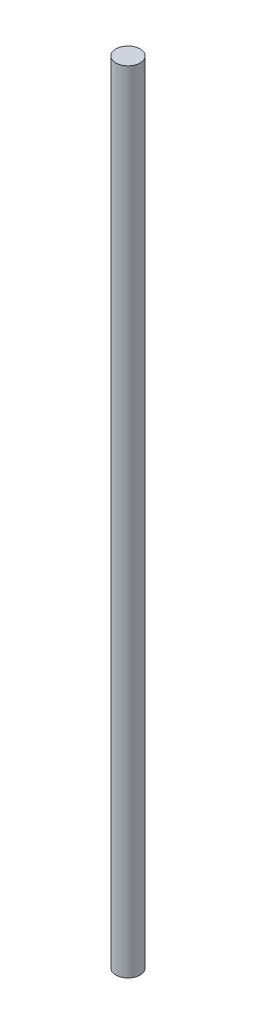
ISO-10303-21;
HEADER;
FILE_DESCRIPTION(('STEP AP214'),'2;1');
FILE_NAME('part.step','',(''),(''),'','','');
FILE_SCHEMA(('AUTOMOTIVE_DESIGN { 1 0 10303 214 1 1 1 1 }'));
ENDSEC;
DATA;
#1=APPLICATION_CONTEXT('core data for automotive mechanical design processes');
#2=APPLICATION_PROTOCOL_DEFINITION('international standard','automotive_design',2000,#1);
#3=PRODUCT_CONTEXT('',#1,'mechanical');
#4=PRODUCT('Part','Part','',(#3));
#5=PRODUCT_RELATED_PRODUCT_CATEGORY('part','',(#4));
#6=PRODUCT_DEFINITION_FORMATION('','',#4);
#7=PRODUCT_DEFINITION_CONTEXT('part definition',#1,'design');
#8=PRODUCT_DEFINITION('design','',#6,#7);
#9=PRODUCT_DEFINITION_SHAPE('','',#8);
#10=(LENGTH_UNIT() NAMED_UNIT(*) SI_UNIT(.MILLI.,.METRE.));
#11=(NAMED_UNIT(*) PLANE_ANGLE_UNIT() SI_UNIT($,.RADIAN.));
#12=(NAMED_UNIT(*) SI_UNIT($,.STERADIAN.) SOLID_ANGLE_UNIT());
#13=UNCERTAINTY_MEASURE_WITH_UNIT(LENGTH_MEASURE(1.E-05),#10,'distance_accuracy_value','');
#14=(GEOMETRIC_REPRESENTATION_CONTEXT(3) GLOBAL_UNCERTAINTY_ASSIGNED_CONTEXT((#13)) GLOBAL_UNIT_ASSIGNED_CONTEXT((#10,
#11,#12)) REPRESENTATION_CONTEXT('',''));
#15=CARTESIAN_POINT('',(0.,0.,0.));
#16=DIRECTION('',(0.,0.,1.));
#17=DIRECTION('',(1.,0.,0.));
#18=AXIS2_PLACEMENT_3D('',#15,#16,#17);
#19=CARTESIAN_POINT('',(0.,325.,0.));
#20=DIRECTION('',(0.,-1.,0.));
#21=DIRECTION('',(0.,0.,-1.));
#22=AXIS2_PLACEMENT_3D('',#19,#20,#21);
#23=CYLINDRICAL_SURFACE('',#22,10.);
#24=CARTESIAN_POINT('',(0.,325.,0.));
#25=DIRECTION('',(0.,1.,0.));
#26=DIRECTION('',(0.,0.,1.));
#27=AXIS2_PLACEMENT_3D('',#24,#25,#26);
#28=CIRCLE('',#27,10.);
#29=CARTESIAN_POINT('',(0.,325.,10.));
#30=VERTEX_POINT('',#29);
#31=EDGE_CURVE('E10',#30,#30,#28,.T.);
#32=ORIENTED_EDGE('',*,*,#31,.F.);
#33=EDGE_LOOP('',(#32));
#34=FACE_BOUND('',#33,.T.);
#35=CARTESIAN_POINT('',(0.,-325.,0.));
#36=DIRECTION('',(0.,1.,0.));
#37=DIRECTION('',(0.,0.,1.));
#38=AXIS2_PLACEMENT_3D('',#35,#36,#37);
#39=CIRCLE('',#38,10.);
#40=CARTESIAN_POINT('',(0.,-325.,10.));
#41=VERTEX_POINT('',#40);
#42=EDGE_CURVE('E34',#41,#41,#39,.T.);
#43=ORIENTED_EDGE('',*,*,#42,.T.);
#44=EDGE_LOOP('',(#43));
#45=FACE_BOUND('',#44,.T.);
#46=ADVANCED_FACE('F31',(#34,#45),#23,.T.);
#47=CARTESIAN_POINT('',(0.,325.,0.));
#48=DIRECTION('',(0.,1.,0.));
#49=DIRECTION('',(0.,0.,1.));
#50=AXIS2_PLACEMENT_3D('',#47,#48,#49);
#51=PLANE('',#50);
#52=ORIENTED_EDGE('',*,*,#31,.T.);
#53=EDGE_LOOP('',(#52));
#54=FACE_BOUND('',#53,.T.);
#55=ADVANCED_FACE('F46',(#54),#51,.T.);
#56=CARTESIAN_POINT('',(0.,-325.,0.));
#57=DIRECTION('',(0.,1.,0.));
#58=DIRECTION('',(0.,0.,1.));
#59=AXIS2_PLACEMENT_3D('',#56,#57,#58);
#60=PLANE('',#59);
#61=ORIENTED_EDGE('',*,*,#42,.F.);
#62=EDGE_LOOP('',(#61));
#63=FACE_BOUND('',#62,.T.);
#64=ADVANCED_FACE('F44',(#63),#60,.F.);
#65=CLOSED_SHELL('',(#46,#55,#64));
#66=MANIFOLD_SOLID_BREP('B2',#65);
#67=ADVANCED_BREP_SHAPE_REPRESENTATION('',(#18,#66),#14);
#68=SHAPE_DEFINITION_REPRESENTATION(#9,#67);
ENDSEC;
END-ISO-10303-21;
